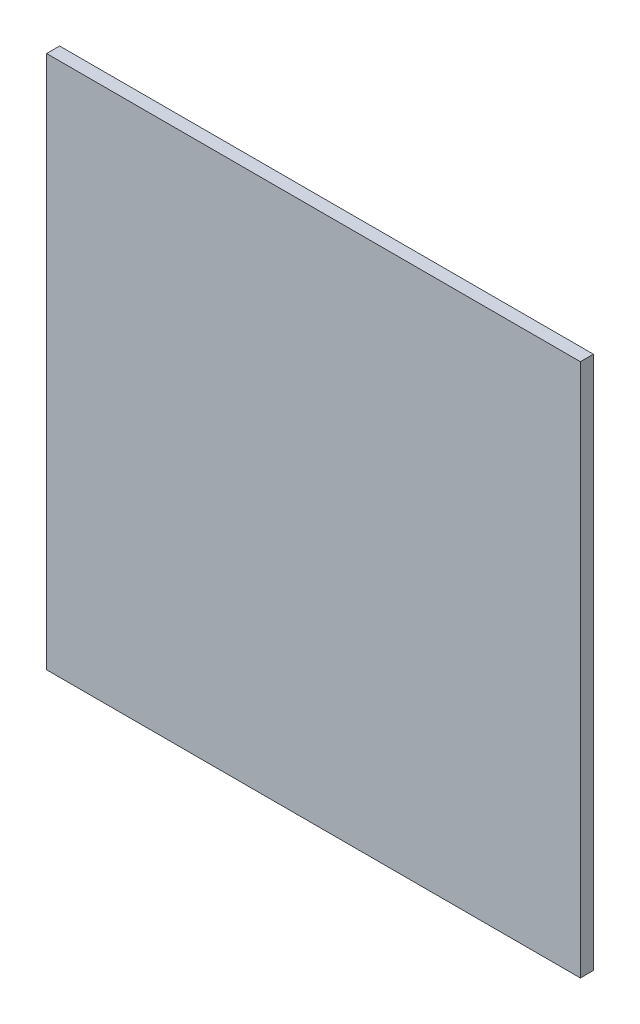
ISO-10303-21;
HEADER;
FILE_DESCRIPTION(('STEP AP214'),'2;1');
FILE_NAME('part.step','',(''),(''),'','','');
FILE_SCHEMA(('AUTOMOTIVE_DESIGN { 1 0 10303 214 1 1 1 1 }'));
ENDSEC;
DATA;
#1=APPLICATION_CONTEXT('core data for automotive mechanical design processes');
#2=APPLICATION_PROTOCOL_DEFINITION('international standard','automotive_design',2000,#1);
#3=PRODUCT_CONTEXT('',#1,'mechanical');
#4=PRODUCT('Part','Part','',(#3));
#5=PRODUCT_RELATED_PRODUCT_CATEGORY('part','',(#4));
#6=PRODUCT_DEFINITION_FORMATION('','',#4);
#7=PRODUCT_DEFINITION_CONTEXT('part definition',#1,'design');
#8=PRODUCT_DEFINITION('design','',#6,#7);
#9=PRODUCT_DEFINITION_SHAPE('','',#8);
#10=(LENGTH_UNIT() NAMED_UNIT(*) SI_UNIT(.MILLI.,.METRE.));
#11=(NAMED_UNIT(*) PLANE_ANGLE_UNIT() SI_UNIT($,.RADIAN.));
#12=(NAMED_UNIT(*) SI_UNIT($,.STERADIAN.) SOLID_ANGLE_UNIT());
#13=UNCERTAINTY_MEASURE_WITH_UNIT(LENGTH_MEASURE(1.E-05),#10,'distance_accuracy_value','');
#14=(GEOMETRIC_REPRESENTATION_CONTEXT(3) GLOBAL_UNCERTAINTY_ASSIGNED_CONTEXT((#13)) GLOBAL_UNIT_ASSIGNED_CONTEXT((#10,
#11,#12)) REPRESENTATION_CONTEXT('',''));
#15=CARTESIAN_POINT('',(0.,0.,0.));
#16=DIRECTION('',(0.,0.,1.));
#17=DIRECTION('',(1.,0.,0.));
#18=AXIS2_PLACEMENT_3D('',#15,#16,#17);
#19=CARTESIAN_POINT('',(205.,205.,10.));
#20=DIRECTION('',(-1.,0.,0.));
#21=DIRECTION('',(0.,0.,1.));
#22=AXIS2_PLACEMENT_3D('',#19,#20,#21);
#23=PLANE('',#22);
#24=DIRECTION('',(0.,1.,0.));
#25=VECTOR('',#24,1.);
#26=CARTESIAN_POINT('',(205.,205.,0.));
#27=LINE('',#26,#25);
#28=CARTESIAN_POINT('',(205.,-205.,0.));
#29=VERTEX_POINT('',#28);
#30=CARTESIAN_POINT('',(205.,205.,0.));
#31=VERTEX_POINT('',#30);
#32=EDGE_CURVE('E96',#29,#31,#27,.T.);
#33=ORIENTED_EDGE('',*,*,#32,.T.);
#34=DIRECTION('',(0.,0.,-1.));
#35=VECTOR('',#34,1.);
#36=CARTESIAN_POINT('',(205.,205.,10.));
#37=LINE('',#36,#35);
#38=CARTESIAN_POINT('',(205.,205.,10.));
#39=VERTEX_POINT('',#38);
#40=EDGE_CURVE('E11',#39,#31,#37,.T.);
#41=ORIENTED_EDGE('',*,*,#40,.F.);
#42=DIRECTION('',(0.,1.,0.));
#43=VECTOR('',#42,1.);
#44=CARTESIAN_POINT('',(205.,205.,10.));
#45=LINE('',#44,#43);
#46=CARTESIAN_POINT('',(205.,-205.,10.));
#47=VERTEX_POINT('',#46);
#48=EDGE_CURVE('E84',#47,#39,#45,.T.);
#49=ORIENTED_EDGE('',*,*,#48,.F.);
#50=DIRECTION('',(0.,0.,-1.));
#51=VECTOR('',#50,1.);
#52=CARTESIAN_POINT('',(205.,-205.,10.));
#53=LINE('',#52,#51);
#54=EDGE_CURVE('E92',#47,#29,#53,.T.);
#55=ORIENTED_EDGE('',*,*,#54,.T.);
#56=EDGE_LOOP('',(#33,#41,#49,#55));
#57=FACE_BOUND('',#56,.T.);
#58=ADVANCED_FACE('F33',(#57),#23,.F.);
#59=CARTESIAN_POINT('',(-205.,205.,10.));
#60=DIRECTION('',(0.,-1.,0.));
#61=DIRECTION('',(0.,0.,-1.));
#62=AXIS2_PLACEMENT_3D('',#59,#60,#61);
#63=PLANE('',#62);
#64=DIRECTION('',(-1.,0.,0.));
#65=VECTOR('',#64,1.);
#66=CARTESIAN_POINT('',(-205.,205.,0.));
#67=LINE('',#66,#65);
#68=CARTESIAN_POINT('',(-205.,205.,0.));
#69=VERTEX_POINT('',#68);
#70=EDGE_CURVE('E88',#31,#69,#67,.T.);
#71=ORIENTED_EDGE('',*,*,#70,.T.);
#72=DIRECTION('',(0.,0.,-1.));
#73=VECTOR('',#72,1.);
#74=CARTESIAN_POINT('',(-205.,205.,10.));
#75=LINE('',#74,#73);
#76=CARTESIAN_POINT('',(-205.,205.,10.));
#77=VERTEX_POINT('',#76);
#78=EDGE_CURVE('E41',#77,#69,#75,.T.);
#79=ORIENTED_EDGE('',*,*,#78,.F.);
#80=DIRECTION('',(-1.,0.,0.));
#81=VECTOR('',#80,1.);
#82=CARTESIAN_POINT('',(-205.,205.,10.));
#83=LINE('',#82,#81);
#84=EDGE_CURVE('E79',#39,#77,#83,.T.);
#85=ORIENTED_EDGE('',*,*,#84,.F.);
#86=ORIENTED_EDGE('',*,*,#40,.T.);
#87=EDGE_LOOP('',(#71,#79,#85,#86));
#88=FACE_BOUND('',#87,.T.);
#89=ADVANCED_FACE('F87',(#88),#63,.F.);
#90=CARTESIAN_POINT('',(-205.,205.,10.));
#91=DIRECTION('',(1.,0.,0.));
#92=DIRECTION('',(0.,0.,-1.));
#93=AXIS2_PLACEMENT_3D('',#90,#91,#92);
#94=PLANE('',#93);
#95=DIRECTION('',(0.,-1.,0.));
#96=VECTOR('',#95,1.);
#97=CARTESIAN_POINT('',(-205.,205.,0.));
#98=LINE('',#97,#96);
#99=CARTESIAN_POINT('',(-205.,-205.,0.));
#100=VERTEX_POINT('',#99);
#101=EDGE_CURVE('E66',#69,#100,#98,.T.);
#102=ORIENTED_EDGE('',*,*,#101,.T.);
#103=DIRECTION('',(0.,0.,-1.));
#104=VECTOR('',#103,1.);
#105=CARTESIAN_POINT('',(-205.,-205.,10.));
#106=LINE('',#105,#104);
#107=CARTESIAN_POINT('',(-205.,-205.,10.));
#108=VERTEX_POINT('',#107);
#109=EDGE_CURVE('E89',#108,#100,#106,.T.);
#110=ORIENTED_EDGE('',*,*,#109,.F.);
#111=DIRECTION('',(0.,-1.,0.));
#112=VECTOR('',#111,1.);
#113=CARTESIAN_POINT('',(-205.,205.,10.));
#114=LINE('',#113,#112);
#115=EDGE_CURVE('E82',#77,#108,#114,.T.);
#116=ORIENTED_EDGE('',*,*,#115,.F.);
#117=ORIENTED_EDGE('',*,*,#78,.T.);
#118=EDGE_LOOP('',(#102,#110,#116,#117));
#119=FACE_BOUND('',#118,.T.);
#120=ADVANCED_FACE('F90',(#119),#94,.F.);
#121=CARTESIAN_POINT('',(-205.,-205.,10.));
#122=DIRECTION('',(0.,1.,0.));
#123=DIRECTION('',(0.,0.,1.));
#124=AXIS2_PLACEMENT_3D('',#121,#122,#123);
#125=PLANE('',#124);
#126=DIRECTION('',(1.,0.,0.));
#127=VECTOR('',#126,1.);
#128=CARTESIAN_POINT('',(-205.,-205.,0.));
#129=LINE('',#128,#127);
#130=EDGE_CURVE('E72',#100,#29,#129,.T.);
#131=ORIENTED_EDGE('',*,*,#130,.T.);
#132=ORIENTED_EDGE('',*,*,#54,.F.);
#133=DIRECTION('',(1.,0.,0.));
#134=VECTOR('',#133,1.);
#135=CARTESIAN_POINT('',(-205.,-205.,10.));
#136=LINE('',#135,#134);
#137=EDGE_CURVE('E49',#108,#47,#136,.T.);
#138=ORIENTED_EDGE('',*,*,#137,.F.);
#139=ORIENTED_EDGE('',*,*,#109,.T.);
#140=EDGE_LOOP('',(#131,#132,#138,#139));
#141=FACE_BOUND('',#140,.T.);
#142=ADVANCED_FACE('F103',(#141),#125,.F.);
#143=CARTESIAN_POINT('',(0.,0.,10.));
#144=DIRECTION('',(0.,0.,1.));
#145=DIRECTION('',(1.,0.,0.));
#146=AXIS2_PLACEMENT_3D('',#143,#144,#145);
#147=PLANE('',#146);
#148=ORIENTED_EDGE('',*,*,#48,.T.);
#149=ORIENTED_EDGE('',*,*,#84,.T.);
#150=ORIENTED_EDGE('',*,*,#115,.T.);
#151=ORIENTED_EDGE('',*,*,#137,.T.);
#152=EDGE_LOOP('',(#148,#149,#150,#151));
#153=FACE_BOUND('',#152,.T.);
#154=ADVANCED_FACE('F80',(#153),#147,.T.);
#155=CARTESIAN_POINT('',(0.,0.,0.));
#156=DIRECTION('',(0.,0.,1.));
#157=DIRECTION('',(1.,0.,0.));
#158=AXIS2_PLACEMENT_3D('',#155,#156,#157);
#159=PLANE('',#158);
#160=ORIENTED_EDGE('',*,*,#32,.F.);
#161=ORIENTED_EDGE('',*,*,#130,.F.);
#162=ORIENTED_EDGE('',*,*,#101,.F.);
#163=ORIENTED_EDGE('',*,*,#70,.F.);
#164=EDGE_LOOP('',(#160,#161,#162,#163));
#165=FACE_BOUND('',#164,.T.);
#166=ADVANCED_FACE('F106',(#165),#159,.F.);
#167=CLOSED_SHELL('',(#58,#89,#120,#142,#154,#166));
#168=MANIFOLD_SOLID_BREP('B2',#167);
#169=ADVANCED_BREP_SHAPE_REPRESENTATION('',(#18,#168),#14);
#170=SHAPE_DEFINITION_REPRESENTATION(#9,#169);
ENDSEC;
END-ISO-10303-21;
